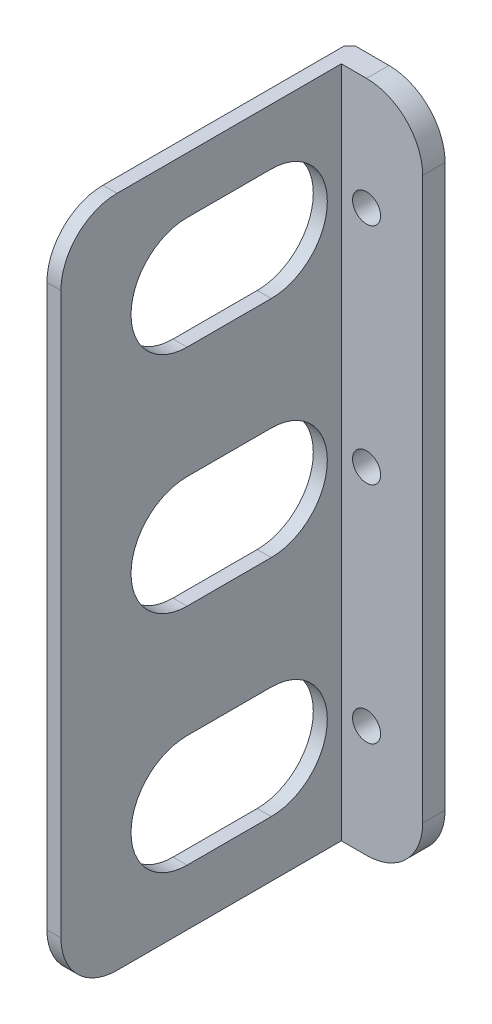
ISO-10303-21;
HEADER;
FILE_DESCRIPTION(('STEP AP214'),'2;1');
FILE_NAME('part.step','',(''),(''),'','','');
FILE_SCHEMA(('AUTOMOTIVE_DESIGN { 1 0 10303 214 1 1 1 1 }'));
ENDSEC;
DATA;
#1=APPLICATION_CONTEXT('core data for automotive mechanical design processes');
#2=APPLICATION_PROTOCOL_DEFINITION('international standard','automotive_design',2000,#1);
#3=PRODUCT_CONTEXT('',#1,'mechanical');
#4=PRODUCT('Part','Part','',(#3));
#5=PRODUCT_RELATED_PRODUCT_CATEGORY('part','',(#4));
#6=PRODUCT_DEFINITION_FORMATION('','',#4);
#7=PRODUCT_DEFINITION_CONTEXT('part definition',#1,'design');
#8=PRODUCT_DEFINITION('design','',#6,#7);
#9=PRODUCT_DEFINITION_SHAPE('','',#8);
#10=(LENGTH_UNIT() NAMED_UNIT(*) SI_UNIT(.MILLI.,.METRE.));
#11=(NAMED_UNIT(*) PLANE_ANGLE_UNIT() SI_UNIT($,.RADIAN.));
#12=(NAMED_UNIT(*) SI_UNIT($,.STERADIAN.) SOLID_ANGLE_UNIT());
#13=UNCERTAINTY_MEASURE_WITH_UNIT(LENGTH_MEASURE(1.E-05),#10,'distance_accuracy_value','');
#14=(GEOMETRIC_REPRESENTATION_CONTEXT(3) GLOBAL_UNCERTAINTY_ASSIGNED_CONTEXT((#13)) GLOBAL_UNIT_ASSIGNED_CONTEXT((#10,
#11,#12)) REPRESENTATION_CONTEXT('',''));
#15=CARTESIAN_POINT('',(0.,0.,0.));
#16=DIRECTION('',(0.,0.,1.));
#17=DIRECTION('',(1.,0.,0.));
#18=AXIS2_PLACEMENT_3D('',#15,#16,#17);
#19=CARTESIAN_POINT('',(0.,0.,0.));
#20=DIRECTION('',(0.,0.,1.));
#21=DIRECTION('',(1.,0.,0.));
#22=AXIS2_PLACEMENT_3D('',#19,#20,#21);
#23=PLANE('',#22);
#24=CARTESIAN_POINT('',(0.,-40.,0.));
#25=DIRECTION('',(0.,0.,1.));
#26=DIRECTION('',(1.,0.,0.));
#27=AXIS2_PLACEMENT_3D('',#24,#25,#26);
#28=CIRCLE('',#27,2.5);
#29=CARTESIAN_POINT('',(2.50000000000001,-40.,0.));
#30=VERTEX_POINT('',#29);
#31=EDGE_CURVE('E308',#30,#30,#28,.T.);
#32=ORIENTED_EDGE('',*,*,#31,.F.);
#33=EDGE_LOOP('',(#32));
#34=FACE_BOUND('',#33,.T.);
#35=CARTESIAN_POINT('',(0.,39.9999999999999,0.));
#36=DIRECTION('',(0.,0.,1.));
#37=DIRECTION('',(1.,0.,0.));
#38=AXIS2_PLACEMENT_3D('',#35,#36,#37);
#39=CIRCLE('',#38,2.5);
#40=CARTESIAN_POINT('',(2.5,39.9999999999999,0.));
#41=VERTEX_POINT('',#40);
#42=EDGE_CURVE('E329',#41,#41,#39,.T.);
#43=ORIENTED_EDGE('',*,*,#42,.F.);
#44=EDGE_LOOP('',(#43));
#45=FACE_BOUND('',#44,.T.);
#46=CARTESIAN_POINT('',(0.,0.,0.));
#47=DIRECTION('',(0.,0.,1.));
#48=DIRECTION('',(1.,0.,0.));
#49=AXIS2_PLACEMENT_3D('',#46,#47,#48);
#50=CIRCLE('',#49,2.5);
#51=CARTESIAN_POINT('',(2.5,0.,0.));
#52=VERTEX_POINT('',#51);
#53=EDGE_CURVE('E332',#52,#52,#50,.T.);
#54=ORIENTED_EDGE('',*,*,#53,.F.);
#55=EDGE_LOOP('',(#54));
#56=FACE_BOUND('',#55,.T.);
#57=DIRECTION('',(1.,0.,0.));
#58=VECTOR('',#57,1.);
#59=CARTESIAN_POINT('',(0.,-60.0000000000001,0.));
#60=LINE('',#59,#58);
#61=CARTESIAN_POINT('',(-4.49999999999996,-60.0000000000001,0.));
#62=VERTEX_POINT('',#61);
#63=CARTESIAN_POINT('',(0.,-60.0000000000001,0.));
#64=VERTEX_POINT('',#63);
#65=EDGE_CURVE('E338',#62,#64,#60,.T.);
#66=ORIENTED_EDGE('',*,*,#65,.T.);
#67=CARTESIAN_POINT('',(0.,-50.0000000000001,0.));
#68=DIRECTION('',(0.,0.,1.));
#69=DIRECTION('',(1.,0.,0.));
#70=AXIS2_PLACEMENT_3D('',#67,#68,#69);
#71=CIRCLE('',#70,10.);
#72=CARTESIAN_POINT('',(9.99999999999997,-50.0000000000001,0.));
#73=VERTEX_POINT('',#72);
#74=EDGE_CURVE('E354',#64,#73,#71,.T.);
#75=ORIENTED_EDGE('',*,*,#74,.T.);
#76=DIRECTION('',(0.,-1.,0.));
#77=VECTOR('',#76,1.);
#78=CARTESIAN_POINT('',(9.99999999999999,0.,0.));
#79=LINE('',#78,#77);
#80=CARTESIAN_POINT('',(10.,49.9999999999999,0.));
#81=VERTEX_POINT('',#80);
#82=EDGE_CURVE('E313',#81,#73,#79,.T.);
#83=ORIENTED_EDGE('',*,*,#82,.F.);
#84=CARTESIAN_POINT('',(0.,50.,0.));
#85=DIRECTION('',(0.,0.,1.));
#86=DIRECTION('',(1.,0.,0.));
#87=AXIS2_PLACEMENT_3D('',#84,#85,#86);
#88=CIRCLE('',#87,10.);
#89=CARTESIAN_POINT('',(0.,60.,0.));
#90=VERTEX_POINT('',#89);
#91=EDGE_CURVE('E352',#81,#90,#88,.T.);
#92=ORIENTED_EDGE('',*,*,#91,.T.);
#93=DIRECTION('',(1.,0.,0.));
#94=VECTOR('',#93,1.);
#95=CARTESIAN_POINT('',(0.,60.,0.));
#96=LINE('',#95,#94);
#97=CARTESIAN_POINT('',(-4.49999999999997,60.,0.));
#98=VERTEX_POINT('',#97);
#99=EDGE_CURVE('E335',#98,#90,#96,.T.);
#100=ORIENTED_EDGE('',*,*,#99,.F.);
#101=DIRECTION('',(0.,-1.,0.));
#102=VECTOR('',#101,1.);
#103=CARTESIAN_POINT('',(-4.49999999999996,0.,0.));
#104=LINE('',#103,#102);
#105=EDGE_CURVE('E295',#98,#62,#104,.T.);
#106=ORIENTED_EDGE('',*,*,#105,.T.);
#107=EDGE_LOOP('',(#66,#75,#83,#92,#100,#106));
#108=FACE_BOUND('',#107,.T.);
#109=ADVANCED_FACE('F41',(#34,#45,#56,#108),#23,.T.);
#110=CARTESIAN_POINT('',(0.,60.,-4.));
#111=DIRECTION('',(0.,-1.,0.));
#112=DIRECTION('',(1.,0.,0.));
#113=AXIS2_PLACEMENT_3D('',#110,#111,#112);
#114=PLANE('',#113);
#115=DIRECTION('',(1.,0.,0.));
#116=VECTOR('',#115,1.);
#117=CARTESIAN_POINT('',(0.,60.,-4.));
#118=LINE('',#117,#116);
#119=CARTESIAN_POINT('',(-5.99999999999995,60.,-4.));
#120=VERTEX_POINT('',#119);
#121=CARTESIAN_POINT('',(0.,60.,-4.));
#122=VERTEX_POINT('',#121);
#123=EDGE_CURVE('E319',#120,#122,#118,.T.);
#124=ORIENTED_EDGE('',*,*,#123,.F.);
#125=DIRECTION('',(-0.707106781186548,0.,0.707106781186548));
#126=VECTOR('',#125,1.);
#127=CARTESIAN_POINT('',(-6.99999999999996,60.,-3.));
#128=LINE('',#127,#126);
#129=CARTESIAN_POINT('',(-6.99999999999997,60.,-2.99999999999999));
#130=VERTEX_POINT('',#129);
#131=EDGE_CURVE('E11',#120,#130,#128,.T.);
#132=ORIENTED_EDGE('',*,*,#131,.T.);
#133=DIRECTION('',(0.,0.,1.));
#134=VECTOR('',#133,1.);
#135=CARTESIAN_POINT('',(-6.99999999999997,60.,-4.));
#136=LINE('',#135,#134);
#137=CARTESIAN_POINT('',(-6.99999999999997,60.,40.));
#138=VERTEX_POINT('',#137);
#139=EDGE_CURVE('E326',#130,#138,#136,.T.);
#140=ORIENTED_EDGE('',*,*,#139,.T.);
#141=DIRECTION('',(1.,0.,0.));
#142=VECTOR('',#141,1.);
#143=CARTESIAN_POINT('',(-4.49999999999997,60.,40.));
#144=LINE('',#143,#142);
#145=CARTESIAN_POINT('',(-4.49999999999997,60.,40.));
#146=VERTEX_POINT('',#145);
#147=EDGE_CURVE('E366',#138,#146,#144,.T.);
#148=ORIENTED_EDGE('',*,*,#147,.T.);
#149=DIRECTION('',(0.,0.,-1.));
#150=VECTOR('',#149,1.);
#151=CARTESIAN_POINT('',(-4.49999999999997,60.,50.));
#152=LINE('',#151,#150);
#153=EDGE_CURVE('E306',#146,#98,#152,.T.);
#154=ORIENTED_EDGE('',*,*,#153,.T.);
#155=ORIENTED_EDGE('',*,*,#99,.T.);
#156=DIRECTION('',(0.,0.,1.));
#157=VECTOR('',#156,1.);
#158=CARTESIAN_POINT('',(0.,60.,-4.));
#159=LINE('',#158,#157);
#160=EDGE_CURVE('E369',#90,#122,#159,.F.);
#161=ORIENTED_EDGE('',*,*,#160,.T.);
#162=EDGE_LOOP('',(#124,#132,#140,#148,#154,#155,#161));
#163=FACE_BOUND('',#162,.T.);
#164=ADVANCED_FACE('F414',(#163),#114,.F.);
#165=CARTESIAN_POINT('',(9.99999999999999,0.,-4.));
#166=DIRECTION('',(-1.,0.,0.));
#167=DIRECTION('',(0.,-1.,0.));
#168=AXIS2_PLACEMENT_3D('',#165,#166,#167);
#169=PLANE('',#168);
#170=ORIENTED_EDGE('',*,*,#82,.T.);
#171=DIRECTION('',(0.,0.,1.));
#172=VECTOR('',#171,1.);
#173=CARTESIAN_POINT('',(9.99999999999997,-50.0000000000001,-4.));
#174=LINE('',#173,#172);
#175=CARTESIAN_POINT('',(9.99999999999997,-50.0000000000001,-4.));
#176=VERTEX_POINT('',#175);
#177=EDGE_CURVE('E359',#73,#176,#174,.F.);
#178=ORIENTED_EDGE('',*,*,#177,.T.);
#179=DIRECTION('',(0.,-1.,0.));
#180=VECTOR('',#179,1.);
#181=CARTESIAN_POINT('',(9.99999999999999,0.,-4.));
#182=LINE('',#181,#180);
#183=CARTESIAN_POINT('',(10.,49.9999999999999,-4.));
#184=VERTEX_POINT('',#183);
#185=EDGE_CURVE('E323',#184,#176,#182,.T.);
#186=ORIENTED_EDGE('',*,*,#185,.F.);
#187=DIRECTION('',(0.,0.,1.));
#188=VECTOR('',#187,1.);
#189=CARTESIAN_POINT('',(10.,49.9999999999999,-4.));
#190=LINE('',#189,#188);
#191=EDGE_CURVE('E356',#184,#81,#190,.T.);
#192=ORIENTED_EDGE('',*,*,#191,.T.);
#193=EDGE_LOOP('',(#170,#178,#186,#192));
#194=FACE_BOUND('',#193,.T.);
#195=ADVANCED_FACE('F429',(#194),#169,.F.);
#196=CARTESIAN_POINT('',(0.,-60.0000000000001,-4.));
#197=DIRECTION('',(0.,-1.,0.));
#198=DIRECTION('',(1.,0.,0.));
#199=AXIS2_PLACEMENT_3D('',#196,#197,#198);
#200=PLANE('',#199);
#201=DIRECTION('',(0.,0.,1.));
#202=VECTOR('',#201,1.);
#203=CARTESIAN_POINT('',(-6.99999999999996,-60.0000000000001,-4.));
#204=LINE('',#203,#202);
#205=CARTESIAN_POINT('',(-6.99999999999996,-60.0000000000001,-2.99999999999999));
#206=VERTEX_POINT('',#205);
#207=CARTESIAN_POINT('',(-6.99999999999996,-60.0000000000001,40.));
#208=VERTEX_POINT('',#207);
#209=EDGE_CURVE('E343',#206,#208,#204,.T.);
#210=ORIENTED_EDGE('',*,*,#209,.F.);
#211=DIRECTION('',(0.707106781186548,0.,-0.707106781186548));
#212=VECTOR('',#211,1.);
#213=CARTESIAN_POINT('',(-2.99999999999998,-60.0000000000001,-6.99999999999996));
#214=LINE('',#213,#212);
#215=CARTESIAN_POINT('',(-5.99999999999994,-60.0000000000001,-4.));
#216=VERTEX_POINT('',#215);
#217=EDGE_CURVE('E64',#206,#216,#214,.T.);
#218=ORIENTED_EDGE('',*,*,#217,.T.);
#219=DIRECTION('',(1.,0.,0.));
#220=VECTOR('',#219,1.);
#221=CARTESIAN_POINT('',(0.,-60.0000000000001,-4.));
#222=LINE('',#221,#220);
#223=CARTESIAN_POINT('',(0.,-60.0000000000001,-4.));
#224=VERTEX_POINT('',#223);
#225=EDGE_CURVE('E321',#216,#224,#222,.T.);
#226=ORIENTED_EDGE('',*,*,#225,.T.);
#227=DIRECTION('',(0.,0.,1.));
#228=VECTOR('',#227,1.);
#229=CARTESIAN_POINT('',(0.,-60.0000000000001,0.));
#230=LINE('',#229,#228);
#231=EDGE_CURVE('E349',#224,#64,#230,.T.);
#232=ORIENTED_EDGE('',*,*,#231,.T.);
#233=ORIENTED_EDGE('',*,*,#65,.F.);
#234=DIRECTION('',(0.,0.,-1.));
#235=VECTOR('',#234,1.);
#236=CARTESIAN_POINT('',(-4.49999999999996,-60.0000000000001,50.));
#237=LINE('',#236,#235);
#238=CARTESIAN_POINT('',(-4.49999999999996,-60.0000000000001,40.));
#239=VERTEX_POINT('',#238);
#240=EDGE_CURVE('E302',#239,#62,#237,.T.);
#241=ORIENTED_EDGE('',*,*,#240,.F.);
#242=DIRECTION('',(1.,0.,0.));
#243=VECTOR('',#242,1.);
#244=CARTESIAN_POINT('',(0.,-60.0000000000001,40.));
#245=LINE('',#244,#243);
#246=EDGE_CURVE('E345',#239,#208,#245,.F.);
#247=ORIENTED_EDGE('',*,*,#246,.T.);
#248=EDGE_LOOP('',(#210,#218,#226,#232,#233,#241,#247));
#249=FACE_BOUND('',#248,.T.);
#250=ADVANCED_FACE('F395',(#249),#200,.T.);
#251=CARTESIAN_POINT('',(0.,0.,-4.));
#252=DIRECTION('',(0.,0.,1.));
#253=DIRECTION('',(1.,0.,0.));
#254=AXIS2_PLACEMENT_3D('',#251,#252,#253);
#255=CYLINDRICAL_SURFACE('',#254,2.5);
#256=CARTESIAN_POINT('',(0.,0.,-4.));
#257=DIRECTION('',(0.,0.,1.));
#258=DIRECTION('',(1.,0.,0.));
#259=AXIS2_PLACEMENT_3D('',#256,#257,#258);
#260=CIRCLE('',#259,2.5);
#261=CARTESIAN_POINT('',(2.5,0.,-4.));
#262=VERTEX_POINT('',#261);
#263=EDGE_CURVE('E316',#262,#262,#260,.T.);
#264=ORIENTED_EDGE('',*,*,#263,.F.);
#265=EDGE_LOOP('',(#264));
#266=FACE_BOUND('',#265,.T.);
#267=ORIENTED_EDGE('',*,*,#53,.T.);
#268=EDGE_LOOP('',(#267));
#269=FACE_BOUND('',#268,.T.);
#270=ADVANCED_FACE('F455',(#266,#269),#255,.F.);
#271=CARTESIAN_POINT('',(0.,39.9999999999999,-4.));
#272=DIRECTION('',(0.,0.,1.));
#273=DIRECTION('',(1.,0.,0.));
#274=AXIS2_PLACEMENT_3D('',#271,#272,#273);
#275=CYLINDRICAL_SURFACE('',#274,2.5);
#276=CARTESIAN_POINT('',(0.,39.9999999999999,-4.));
#277=DIRECTION('',(0.,0.,1.));
#278=DIRECTION('',(1.,0.,0.));
#279=AXIS2_PLACEMENT_3D('',#276,#277,#278);
#280=CIRCLE('',#279,2.5);
#281=CARTESIAN_POINT('',(2.5,39.9999999999999,-4.));
#282=VERTEX_POINT('',#281);
#283=EDGE_CURVE('E312',#282,#282,#280,.T.);
#284=ORIENTED_EDGE('',*,*,#283,.F.);
#285=EDGE_LOOP('',(#284));
#286=FACE_BOUND('',#285,.T.);
#287=ORIENTED_EDGE('',*,*,#42,.T.);
#288=EDGE_LOOP('',(#287));
#289=FACE_BOUND('',#288,.T.);
#290=ADVANCED_FACE('F462',(#286,#289),#275,.F.);
#291=CARTESIAN_POINT('',(0.,-40.,-4.));
#292=DIRECTION('',(0.,0.,1.));
#293=DIRECTION('',(1.,0.,0.));
#294=AXIS2_PLACEMENT_3D('',#291,#292,#293);
#295=CYLINDRICAL_SURFACE('',#294,2.5);
#296=CARTESIAN_POINT('',(0.,-40.,-4.));
#297=DIRECTION('',(0.,0.,1.));
#298=DIRECTION('',(1.,0.,0.));
#299=AXIS2_PLACEMENT_3D('',#296,#297,#298);
#300=CIRCLE('',#299,2.5);
#301=CARTESIAN_POINT('',(2.50000000000001,-40.,-4.));
#302=VERTEX_POINT('',#301);
#303=EDGE_CURVE('E309',#302,#302,#300,.T.);
#304=ORIENTED_EDGE('',*,*,#303,.F.);
#305=EDGE_LOOP('',(#304));
#306=FACE_BOUND('',#305,.T.);
#307=ORIENTED_EDGE('',*,*,#31,.T.);
#308=EDGE_LOOP('',(#307));
#309=FACE_BOUND('',#308,.T.);
#310=ADVANCED_FACE('F457',(#306,#309),#295,.F.);
#311=CARTESIAN_POINT('',(-6.99999999999996,0.,-4.));
#312=DIRECTION('',(-1.,0.,0.));
#313=DIRECTION('',(0.,-1.,0.));
#314=AXIS2_PLACEMENT_3D('',#311,#312,#313);
#315=PLANE('',#314);
#316=CARTESIAN_POINT('',(-6.99999999999996,-40.,12.5));
#317=DIRECTION('',(-1.,0.,0.));
#318=DIRECTION('',(0.,-1.,0.));
#319=AXIS2_PLACEMENT_3D('',#316,#317,#318);
#320=CIRCLE('',#319,10.);
#321=CARTESIAN_POINT('',(-6.99999999999996,-30.,12.5));
#322=VERTEX_POINT('',#321);
#323=CARTESIAN_POINT('',(-6.99999999999996,-50.,12.5));
#324=VERTEX_POINT('',#323);
#325=EDGE_CURVE('E293',#322,#324,#320,.T.);
#326=ORIENTED_EDGE('',*,*,#325,.F.);
#327=DIRECTION('',(0.,0.,-1.));
#328=VECTOR('',#327,1.);
#329=CARTESIAN_POINT('',(-6.99999999999996,-30.,-4.));
#330=LINE('',#329,#328);
#331=CARTESIAN_POINT('',(-6.99999999999996,-30.,27.5));
#332=VERTEX_POINT('',#331);
#333=EDGE_CURVE('E288',#332,#322,#330,.T.);
#334=ORIENTED_EDGE('',*,*,#333,.F.);
#335=CARTESIAN_POINT('',(-6.99999999999996,-40.,27.5));
#336=DIRECTION('',(-1.,0.,0.));
#337=DIRECTION('',(0.,-1.,0.));
#338=AXIS2_PLACEMENT_3D('',#335,#336,#337);
#339=CIRCLE('',#338,10.);
#340=CARTESIAN_POINT('',(-6.99999999999996,-50.,27.5));
#341=VERTEX_POINT('',#340);
#342=EDGE_CURVE('E203',#341,#332,#339,.T.);
#343=ORIENTED_EDGE('',*,*,#342,.F.);
#344=DIRECTION('',(0.,0.,1.));
#345=VECTOR('',#344,1.);
#346=CARTESIAN_POINT('',(-6.99999999999996,-50.,-4.));
#347=LINE('',#346,#345);
#348=EDGE_CURVE('E291',#324,#341,#347,.T.);
#349=ORIENTED_EDGE('',*,*,#348,.F.);
#350=EDGE_LOOP('',(#326,#334,#343,#349));
#351=FACE_BOUND('',#350,.T.);
#352=CARTESIAN_POINT('',(-6.99999999999996,0.,12.5));
#353=DIRECTION('',(-1.,0.,0.));
#354=DIRECTION('',(0.,-1.,0.));
#355=AXIS2_PLACEMENT_3D('',#352,#353,#354);
#356=CIRCLE('',#355,10.);
#357=CARTESIAN_POINT('',(-6.99999999999996,9.99999999999999,12.5));
#358=VERTEX_POINT('',#357);
#359=CARTESIAN_POINT('',(-6.99999999999996,-10.,12.5));
#360=VERTEX_POINT('',#359);
#361=EDGE_CURVE('E286',#358,#360,#356,.T.);
#362=ORIENTED_EDGE('',*,*,#361,.F.);
#363=DIRECTION('',(0.,0.,-1.));
#364=VECTOR('',#363,1.);
#365=CARTESIAN_POINT('',(-6.99999999999996,9.99999999999999,-4.));
#366=LINE('',#365,#364);
#367=CARTESIAN_POINT('',(-6.99999999999996,9.99999999999999,27.5));
#368=VERTEX_POINT('',#367);
#369=EDGE_CURVE('E279',#368,#358,#366,.T.);
#370=ORIENTED_EDGE('',*,*,#369,.F.);
#371=CARTESIAN_POINT('',(-6.99999999999996,0.,27.5));
#372=DIRECTION('',(-1.,0.,0.));
#373=DIRECTION('',(0.,-1.,0.));
#374=AXIS2_PLACEMENT_3D('',#371,#372,#373);
#375=CIRCLE('',#374,10.);
#376=CARTESIAN_POINT('',(-6.99999999999996,-10.,27.5));
#377=VERTEX_POINT('',#376);
#378=EDGE_CURVE('E281',#377,#368,#375,.T.);
#379=ORIENTED_EDGE('',*,*,#378,.F.);
#380=DIRECTION('',(0.,0.,1.));
#381=VECTOR('',#380,1.);
#382=CARTESIAN_POINT('',(-6.99999999999996,-10.,-4.));
#383=LINE('',#382,#381);
#384=EDGE_CURVE('E284',#360,#377,#383,.T.);
#385=ORIENTED_EDGE('',*,*,#384,.F.);
#386=EDGE_LOOP('',(#362,#370,#379,#385));
#387=FACE_BOUND('',#386,.T.);
#388=CARTESIAN_POINT('',(-6.99999999999997,40.,12.5));
#389=DIRECTION('',(-1.,0.,0.));
#390=DIRECTION('',(0.,-1.,0.));
#391=AXIS2_PLACEMENT_3D('',#388,#389,#390);
#392=CIRCLE('',#391,10.);
#393=CARTESIAN_POINT('',(-6.99999999999997,50.,12.5));
#394=VERTEX_POINT('',#393);
#395=CARTESIAN_POINT('',(-6.99999999999996,30.,12.5));
#396=VERTEX_POINT('',#395);
#397=EDGE_CURVE('E277',#394,#396,#392,.T.);
#398=ORIENTED_EDGE('',*,*,#397,.F.);
#399=DIRECTION('',(0.,0.,-1.));
#400=VECTOR('',#399,1.);
#401=CARTESIAN_POINT('',(-6.99999999999997,50.,-4.));
#402=LINE('',#401,#400);
#403=CARTESIAN_POINT('',(-6.99999999999997,50.,27.5));
#404=VERTEX_POINT('',#403);
#405=EDGE_CURVE('E228',#404,#394,#402,.T.);
#406=ORIENTED_EDGE('',*,*,#405,.F.);
#407=CARTESIAN_POINT('',(-6.99999999999997,40.,27.5));
#408=DIRECTION('',(-1.,0.,0.));
#409=DIRECTION('',(0.,-1.,0.));
#410=AXIS2_PLACEMENT_3D('',#407,#408,#409);
#411=CIRCLE('',#410,10.);
#412=CARTESIAN_POINT('',(-6.99999999999997,30.,27.5));
#413=VERTEX_POINT('',#412);
#414=EDGE_CURVE('E272',#413,#404,#411,.T.);
#415=ORIENTED_EDGE('',*,*,#414,.F.);
#416=DIRECTION('',(0.,0.,1.));
#417=VECTOR('',#416,1.);
#418=CARTESIAN_POINT('',(-6.99999999999997,30.,-4.));
#419=LINE('',#418,#417);
#420=EDGE_CURVE('E275',#396,#413,#419,.T.);
#421=ORIENTED_EDGE('',*,*,#420,.F.);
#422=EDGE_LOOP('',(#398,#406,#415,#421));
#423=FACE_BOUND('',#422,.T.);
#424=ORIENTED_EDGE('',*,*,#139,.F.);
#425=DIRECTION('',(0.,-1.,0.));
#426=VECTOR('',#425,1.);
#427=CARTESIAN_POINT('',(-6.99999999999996,-60.0000000000001,-2.99999999999999));
#428=LINE('',#427,#426);
#429=EDGE_CURVE('E386',#130,#206,#428,.T.);
#430=ORIENTED_EDGE('',*,*,#429,.T.);
#431=ORIENTED_EDGE('',*,*,#209,.T.);
#432=CARTESIAN_POINT('',(-6.99999999999996,-50.0000000000001,40.));
#433=DIRECTION('',(-1.,0.,0.));
#434=DIRECTION('',(0.,-1.,0.));
#435=AXIS2_PLACEMENT_3D('',#432,#433,#434);
#436=CIRCLE('',#435,10.);
#437=CARTESIAN_POINT('',(-6.99999999999996,-50.0000000000001,50.));
#438=VERTEX_POINT('',#437);
#439=EDGE_CURVE('E381',#208,#438,#436,.T.);
#440=ORIENTED_EDGE('',*,*,#439,.T.);
#441=DIRECTION('',(0.,-1.,0.));
#442=VECTOR('',#441,1.);
#443=CARTESIAN_POINT('',(-6.99999999999996,0.,50.));
#444=LINE('',#443,#442);
#445=CARTESIAN_POINT('',(-6.99999999999997,50.,50.));
#446=VERTEX_POINT('',#445);
#447=EDGE_CURVE('E299',#446,#438,#444,.T.);
#448=ORIENTED_EDGE('',*,*,#447,.F.);
#449=CARTESIAN_POINT('',(-6.99999999999997,50.,40.));
#450=DIRECTION('',(-1.,0.,0.));
#451=DIRECTION('',(0.,-1.,0.));
#452=AXIS2_PLACEMENT_3D('',#449,#450,#451);
#453=CIRCLE('',#452,10.);
#454=EDGE_CURVE('E383',#446,#138,#453,.T.);
#455=ORIENTED_EDGE('',*,*,#454,.T.);
#456=EDGE_LOOP('',(#424,#430,#431,#440,#448,#455));
#457=FACE_BOUND('',#456,.T.);
#458=ADVANCED_FACE('F392',(#351,#387,#423,#457),#315,.T.);
#459=CARTESIAN_POINT('',(0.,0.,-4.));
#460=DIRECTION('',(0.,0.,1.));
#461=DIRECTION('',(1.,0.,0.));
#462=AXIS2_PLACEMENT_3D('',#459,#460,#461);
#463=PLANE('',#462);
#464=ORIENTED_EDGE('',*,*,#303,.T.);
#465=EDGE_LOOP('',(#464));
#466=FACE_BOUND('',#465,.T.);
#467=ORIENTED_EDGE('',*,*,#283,.T.);
#468=EDGE_LOOP('',(#467));
#469=FACE_BOUND('',#468,.T.);
#470=ORIENTED_EDGE('',*,*,#263,.T.);
#471=EDGE_LOOP('',(#470));
#472=FACE_BOUND('',#471,.T.);
#473=ORIENTED_EDGE('',*,*,#225,.F.);
#474=DIRECTION('',(0.,1.,0.));
#475=VECTOR('',#474,1.);
#476=CARTESIAN_POINT('',(-5.99999999999995,60.,-4.));
#477=LINE('',#476,#475);
#478=EDGE_CURVE('E50',#216,#120,#477,.T.);
#479=ORIENTED_EDGE('',*,*,#478,.T.);
#480=ORIENTED_EDGE('',*,*,#123,.T.);
#481=CARTESIAN_POINT('',(0.,50.,-4.));
#482=DIRECTION('',(0.,0.,1.));
#483=DIRECTION('',(1.,0.,0.));
#484=AXIS2_PLACEMENT_3D('',#481,#482,#483);
#485=CIRCLE('',#484,10.);
#486=EDGE_CURVE('E361',#122,#184,#485,.F.);
#487=ORIENTED_EDGE('',*,*,#486,.T.);
#488=ORIENTED_EDGE('',*,*,#185,.T.);
#489=CARTESIAN_POINT('',(0.,-50.0000000000001,-4.));
#490=DIRECTION('',(0.,0.,1.));
#491=DIRECTION('',(1.,0.,0.));
#492=AXIS2_PLACEMENT_3D('',#489,#490,#491);
#493=CIRCLE('',#492,10.);
#494=EDGE_CURVE('E363',#176,#224,#493,.F.);
#495=ORIENTED_EDGE('',*,*,#494,.T.);
#496=EDGE_LOOP('',(#473,#479,#480,#487,#488,#495));
#497=FACE_BOUND('',#496,.T.);
#498=ADVANCED_FACE('F426',(#466,#469,#472,#497),#463,.F.);
#499=CARTESIAN_POINT('',(-4.49999999999996,0.,50.));
#500=DIRECTION('',(1.,0.,0.));
#501=DIRECTION('',(0.,1.,0.));
#502=AXIS2_PLACEMENT_3D('',#499,#500,#501);
#503=PLANE('',#502);
#504=CARTESIAN_POINT('',(-4.49999999999996,-40.,12.5));
#505=DIRECTION('',(1.,0.,0.));
#506=DIRECTION('',(0.,1.,0.));
#507=AXIS2_PLACEMENT_3D('',#504,#505,#506);
#508=CIRCLE('',#507,10.);
#509=CARTESIAN_POINT('',(-4.49999999999996,-50.,12.5));
#510=VERTEX_POINT('',#509);
#511=CARTESIAN_POINT('',(-4.49999999999996,-30.,12.5));
#512=VERTEX_POINT('',#511);
#513=EDGE_CURVE('E216',#510,#512,#508,.T.);
#514=ORIENTED_EDGE('',*,*,#513,.F.);
#515=DIRECTION('',(0.,0.,-1.));
#516=VECTOR('',#515,1.);
#517=CARTESIAN_POINT('',(-4.49999999999996,-50.,12.5));
#518=LINE('',#517,#516);
#519=CARTESIAN_POINT('',(-4.49999999999996,-50.,27.5));
#520=VERTEX_POINT('',#519);
#521=EDGE_CURVE('E221',#520,#510,#518,.T.);
#522=ORIENTED_EDGE('',*,*,#521,.F.);
#523=CARTESIAN_POINT('',(-4.49999999999996,-40.,27.5));
#524=DIRECTION('',(1.,0.,0.));
#525=DIRECTION('',(0.,1.,0.));
#526=AXIS2_PLACEMENT_3D('',#523,#524,#525);
#527=CIRCLE('',#526,10.);
#528=CARTESIAN_POINT('',(-4.49999999999996,-30.,27.5));
#529=VERTEX_POINT('',#528);
#530=EDGE_CURVE('E200',#529,#520,#527,.T.);
#531=ORIENTED_EDGE('',*,*,#530,.F.);
#532=DIRECTION('',(0.,0.,1.));
#533=VECTOR('',#532,1.);
#534=CARTESIAN_POINT('',(-4.49999999999996,-30.,12.5));
#535=LINE('',#534,#533);
#536=EDGE_CURVE('E211',#512,#529,#535,.T.);
#537=ORIENTED_EDGE('',*,*,#536,.F.);
#538=EDGE_LOOP('',(#514,#522,#531,#537));
#539=FACE_BOUND('',#538,.T.);
#540=CARTESIAN_POINT('',(-4.49999999999996,0.,12.5));
#541=DIRECTION('',(1.,0.,0.));
#542=DIRECTION('',(0.,1.,0.));
#543=AXIS2_PLACEMENT_3D('',#540,#541,#542);
#544=CIRCLE('',#543,10.);
#545=CARTESIAN_POINT('',(-4.49999999999996,-10.,12.5));
#546=VERTEX_POINT('',#545);
#547=CARTESIAN_POINT('',(-4.49999999999997,10.,12.5));
#548=VERTEX_POINT('',#547);
#549=EDGE_CURVE('E250',#546,#548,#544,.T.);
#550=ORIENTED_EDGE('',*,*,#549,.F.);
#551=DIRECTION('',(0.,0.,-1.));
#552=VECTOR('',#551,1.);
#553=CARTESIAN_POINT('',(-4.49999999999996,-10.,12.5));
#554=LINE('',#553,#552);
#555=CARTESIAN_POINT('',(-4.49999999999996,-10.,27.5));
#556=VERTEX_POINT('',#555);
#557=EDGE_CURVE('E234',#556,#546,#554,.T.);
#558=ORIENTED_EDGE('',*,*,#557,.F.);
#559=CARTESIAN_POINT('',(-4.49999999999996,0.,27.5));
#560=DIRECTION('',(1.,0.,0.));
#561=DIRECTION('',(0.,1.,0.));
#562=AXIS2_PLACEMENT_3D('',#559,#560,#561);
#563=CIRCLE('',#562,10.);
#564=CARTESIAN_POINT('',(-4.49999999999997,10.,27.5));
#565=VERTEX_POINT('',#564);
#566=EDGE_CURVE('E244',#565,#556,#563,.T.);
#567=ORIENTED_EDGE('',*,*,#566,.F.);
#568=DIRECTION('',(0.,0.,1.));
#569=VECTOR('',#568,1.);
#570=CARTESIAN_POINT('',(-4.49999999999997,10.,12.5));
#571=LINE('',#570,#569);
#572=EDGE_CURVE('E247',#548,#565,#571,.T.);
#573=ORIENTED_EDGE('',*,*,#572,.F.);
#574=EDGE_LOOP('',(#550,#558,#567,#573));
#575=FACE_BOUND('',#574,.T.);
#576=CARTESIAN_POINT('',(-4.49999999999997,40.,12.5));
#577=DIRECTION('',(1.,0.,0.));
#578=DIRECTION('',(0.,1.,0.));
#579=AXIS2_PLACEMENT_3D('',#576,#577,#578);
#580=CIRCLE('',#579,10.);
#581=CARTESIAN_POINT('',(-4.49999999999997,30.,12.5));
#582=VERTEX_POINT('',#581);
#583=CARTESIAN_POINT('',(-4.49999999999997,50.,12.5));
#584=VERTEX_POINT('',#583);
#585=EDGE_CURVE('E241',#582,#584,#580,.T.);
#586=ORIENTED_EDGE('',*,*,#585,.F.);
#587=DIRECTION('',(0.,0.,-1.));
#588=VECTOR('',#587,1.);
#589=CARTESIAN_POINT('',(-4.49999999999997,30.,12.5));
#590=LINE('',#589,#588);
#591=CARTESIAN_POINT('',(-4.49999999999997,30.,27.5));
#592=VERTEX_POINT('',#591);
#593=EDGE_CURVE('E255',#592,#582,#590,.T.);
#594=ORIENTED_EDGE('',*,*,#593,.F.);
#595=CARTESIAN_POINT('',(-4.49999999999997,40.,27.5));
#596=DIRECTION('',(1.,0.,0.));
#597=DIRECTION('',(0.,1.,0.));
#598=AXIS2_PLACEMENT_3D('',#595,#596,#597);
#599=CIRCLE('',#598,10.);
#600=CARTESIAN_POINT('',(-4.49999999999997,50.,27.5));
#601=VERTEX_POINT('',#600);
#602=EDGE_CURVE('E264',#601,#592,#599,.T.);
#603=ORIENTED_EDGE('',*,*,#602,.F.);
#604=DIRECTION('',(0.,0.,1.));
#605=VECTOR('',#604,1.);
#606=CARTESIAN_POINT('',(-4.49999999999997,50.,12.5));
#607=LINE('',#606,#605);
#608=EDGE_CURVE('E267',#584,#601,#607,.T.);
#609=ORIENTED_EDGE('',*,*,#608,.F.);
#610=EDGE_LOOP('',(#586,#594,#603,#609));
#611=FACE_BOUND('',#610,.T.);
#612=ORIENTED_EDGE('',*,*,#153,.F.);
#613=CARTESIAN_POINT('',(-4.49999999999997,50.,40.));
#614=DIRECTION('',(1.,0.,0.));
#615=DIRECTION('',(0.,1.,0.));
#616=AXIS2_PLACEMENT_3D('',#613,#614,#615);
#617=CIRCLE('',#616,10.);
#618=CARTESIAN_POINT('',(-4.49999999999997,50.,50.));
#619=VERTEX_POINT('',#618);
#620=EDGE_CURVE('E374',#146,#619,#617,.T.);
#621=ORIENTED_EDGE('',*,*,#620,.T.);
#622=DIRECTION('',(0.,-1.,0.));
#623=VECTOR('',#622,1.);
#624=CARTESIAN_POINT('',(-4.49999999999996,0.,50.));
#625=LINE('',#624,#623);
#626=CARTESIAN_POINT('',(-4.49999999999996,-50.0000000000001,50.));
#627=VERTEX_POINT('',#626);
#628=EDGE_CURVE('E296',#619,#627,#625,.T.);
#629=ORIENTED_EDGE('',*,*,#628,.T.);
#630=CARTESIAN_POINT('',(-4.49999999999996,-50.0000000000001,40.));
#631=DIRECTION('',(1.,0.,0.));
#632=DIRECTION('',(0.,1.,0.));
#633=AXIS2_PLACEMENT_3D('',#630,#631,#632);
#634=CIRCLE('',#633,10.);
#635=EDGE_CURVE('E372',#627,#239,#634,.T.);
#636=ORIENTED_EDGE('',*,*,#635,.T.);
#637=ORIENTED_EDGE('',*,*,#240,.T.);
#638=ORIENTED_EDGE('',*,*,#105,.F.);
#639=EDGE_LOOP('',(#612,#621,#629,#636,#637,#638));
#640=FACE_BOUND('',#639,.T.);
#641=ADVANCED_FACE('F218',(#539,#575,#611,#640),#503,.T.);
#642=CARTESIAN_POINT('',(0.,0.,50.));
#643=DIRECTION('',(0.,0.,1.));
#644=DIRECTION('',(1.,0.,0.));
#645=AXIS2_PLACEMENT_3D('',#642,#643,#644);
#646=PLANE('',#645);
#647=ORIENTED_EDGE('',*,*,#628,.F.);
#648=DIRECTION('',(1.,0.,0.));
#649=VECTOR('',#648,1.);
#650=CARTESIAN_POINT('',(-6.99999999999997,50.,50.));
#651=LINE('',#650,#649);
#652=EDGE_CURVE('E379',#619,#446,#651,.F.);
#653=ORIENTED_EDGE('',*,*,#652,.T.);
#654=ORIENTED_EDGE('',*,*,#447,.T.);
#655=DIRECTION('',(1.,0.,0.));
#656=VECTOR('',#655,1.);
#657=CARTESIAN_POINT('',(0.,-50.0000000000001,50.));
#658=LINE('',#657,#656);
#659=EDGE_CURVE('E376',#438,#627,#658,.T.);
#660=ORIENTED_EDGE('',*,*,#659,.T.);
#661=EDGE_LOOP('',(#647,#653,#654,#660));
#662=FACE_BOUND('',#661,.T.);
#663=ADVANCED_FACE('F407',(#662),#646,.T.);
#664=CARTESIAN_POINT('',(0.,-50.0000000000001,-4.));
#665=DIRECTION('',(0.,0.,-1.));
#666=DIRECTION('',(-1.,0.,0.));
#667=AXIS2_PLACEMENT_3D('',#664,#665,#666);
#668=CYLINDRICAL_SURFACE('',#667,10.);
#669=ORIENTED_EDGE('',*,*,#494,.F.);
#670=ORIENTED_EDGE('',*,*,#177,.F.);
#671=ORIENTED_EDGE('',*,*,#74,.F.);
#672=ORIENTED_EDGE('',*,*,#231,.F.);
#673=EDGE_LOOP('',(#669,#670,#671,#672));
#674=FACE_BOUND('',#673,.T.);
#675=ADVANCED_FACE('F432',(#674),#668,.T.);
#676=CARTESIAN_POINT('',(0.,50.,-4.));
#677=DIRECTION('',(0.,0.,1.));
#678=DIRECTION('',(1.,0.,0.));
#679=AXIS2_PLACEMENT_3D('',#676,#677,#678);
#680=CYLINDRICAL_SURFACE('',#679,10.);
#681=ORIENTED_EDGE('',*,*,#486,.F.);
#682=ORIENTED_EDGE('',*,*,#160,.F.);
#683=ORIENTED_EDGE('',*,*,#91,.F.);
#684=ORIENTED_EDGE('',*,*,#191,.F.);
#685=EDGE_LOOP('',(#681,#682,#683,#684));
#686=FACE_BOUND('',#685,.T.);
#687=ADVANCED_FACE('F423',(#686),#680,.T.);
#688=CARTESIAN_POINT('',(0.,50.,40.));
#689=DIRECTION('',(-1.,0.,0.));
#690=DIRECTION('',(0.,-1.,0.));
#691=AXIS2_PLACEMENT_3D('',#688,#689,#690);
#692=CYLINDRICAL_SURFACE('',#691,10.);
#693=ORIENTED_EDGE('',*,*,#454,.F.);
#694=ORIENTED_EDGE('',*,*,#652,.F.);
#695=ORIENTED_EDGE('',*,*,#620,.F.);
#696=ORIENTED_EDGE('',*,*,#147,.F.);
#697=EDGE_LOOP('',(#693,#694,#695,#696));
#698=FACE_BOUND('',#697,.T.);
#699=ADVANCED_FACE('F410',(#698),#692,.T.);
#700=CARTESIAN_POINT('',(0.,-50.0000000000001,40.));
#701=DIRECTION('',(1.,0.,0.));
#702=DIRECTION('',(0.,1.,0.));
#703=AXIS2_PLACEMENT_3D('',#700,#701,#702);
#704=CYLINDRICAL_SURFACE('',#703,10.);
#705=ORIENTED_EDGE('',*,*,#439,.F.);
#706=ORIENTED_EDGE('',*,*,#246,.F.);
#707=ORIENTED_EDGE('',*,*,#635,.F.);
#708=ORIENTED_EDGE('',*,*,#659,.F.);
#709=EDGE_LOOP('',(#705,#706,#707,#708));
#710=FACE_BOUND('',#709,.T.);
#711=ADVANCED_FACE('F402',(#710),#704,.T.);
#712=CARTESIAN_POINT('',(-54.5,40.,12.5));
#713=DIRECTION('',(1.,0.,0.));
#714=DIRECTION('',(0.,1.,0.));
#715=AXIS2_PLACEMENT_3D('',#712,#713,#714);
#716=CYLINDRICAL_SURFACE('',#715,10.);
#717=ORIENTED_EDGE('',*,*,#397,.T.);
#718=DIRECTION('',(1.,0.,0.));
#719=VECTOR('',#718,1.);
#720=CARTESIAN_POINT('',(-54.5,30.,12.5));
#721=LINE('',#720,#719);
#722=EDGE_CURVE('E260',#396,#582,#721,.T.);
#723=ORIENTED_EDGE('',*,*,#722,.T.);
#724=ORIENTED_EDGE('',*,*,#585,.T.);
#725=DIRECTION('',(1.,0.,0.));
#726=VECTOR('',#725,1.);
#727=CARTESIAN_POINT('',(-54.5,50.,12.5));
#728=LINE('',#727,#726);
#729=EDGE_CURVE('E252',#394,#584,#728,.T.);
#730=ORIENTED_EDGE('',*,*,#729,.F.);
#731=EDGE_LOOP('',(#717,#723,#724,#730));
#732=FACE_BOUND('',#731,.T.);
#733=ADVANCED_FACE('F476',(#732),#716,.F.);
#734=CARTESIAN_POINT('',(-54.5,30.,12.5));
#735=DIRECTION('',(0.,-1.,0.));
#736=DIRECTION('',(1.,0.,0.));
#737=AXIS2_PLACEMENT_3D('',#734,#735,#736);
#738=PLANE('',#737);
#739=ORIENTED_EDGE('',*,*,#420,.T.);
#740=DIRECTION('',(1.,0.,0.));
#741=VECTOR('',#740,1.);
#742=CARTESIAN_POINT('',(-54.5,30.,27.5));
#743=LINE('',#742,#741);
#744=EDGE_CURVE('E258',#413,#592,#743,.T.);
#745=ORIENTED_EDGE('',*,*,#744,.T.);
#746=ORIENTED_EDGE('',*,*,#593,.T.);
#747=ORIENTED_EDGE('',*,*,#722,.F.);
#748=EDGE_LOOP('',(#739,#745,#746,#747));
#749=FACE_BOUND('',#748,.T.);
#750=ADVANCED_FACE('F480',(#749),#738,.F.);
#751=CARTESIAN_POINT('',(-54.5,40.,27.5));
#752=DIRECTION('',(1.,0.,0.));
#753=DIRECTION('',(0.,1.,0.));
#754=AXIS2_PLACEMENT_3D('',#751,#752,#753);
#755=CYLINDRICAL_SURFACE('',#754,10.);
#756=ORIENTED_EDGE('',*,*,#414,.T.);
#757=DIRECTION('',(1.,0.,0.));
#758=VECTOR('',#757,1.);
#759=CARTESIAN_POINT('',(-54.5,50.,27.5));
#760=LINE('',#759,#758);
#761=EDGE_CURVE('E256',#404,#601,#760,.T.);
#762=ORIENTED_EDGE('',*,*,#761,.T.);
#763=ORIENTED_EDGE('',*,*,#602,.T.);
#764=ORIENTED_EDGE('',*,*,#744,.F.);
#765=EDGE_LOOP('',(#756,#762,#763,#764));
#766=FACE_BOUND('',#765,.T.);
#767=ADVANCED_FACE('F486',(#766),#755,.F.);
#768=CARTESIAN_POINT('',(-54.5,50.,12.5));
#769=DIRECTION('',(0.,1.,0.));
#770=DIRECTION('',(-1.,0.,0.));
#771=AXIS2_PLACEMENT_3D('',#768,#769,#770);
#772=PLANE('',#771);
#773=ORIENTED_EDGE('',*,*,#405,.T.);
#774=ORIENTED_EDGE('',*,*,#729,.T.);
#775=ORIENTED_EDGE('',*,*,#608,.T.);
#776=ORIENTED_EDGE('',*,*,#761,.F.);
#777=EDGE_LOOP('',(#773,#774,#775,#776));
#778=FACE_BOUND('',#777,.T.);
#779=ADVANCED_FACE('F493',(#778),#772,.F.);
#780=CARTESIAN_POINT('',(-54.5,0.,12.5));
#781=DIRECTION('',(1.,0.,0.));
#782=DIRECTION('',(0.,1.,0.));
#783=AXIS2_PLACEMENT_3D('',#780,#781,#782);
#784=CYLINDRICAL_SURFACE('',#783,10.);
#785=ORIENTED_EDGE('',*,*,#361,.T.);
#786=DIRECTION('',(1.,0.,0.));
#787=VECTOR('',#786,1.);
#788=CARTESIAN_POINT('',(-54.5,-10.,12.5));
#789=LINE('',#788,#787);
#790=EDGE_CURVE('E239',#360,#546,#789,.T.);
#791=ORIENTED_EDGE('',*,*,#790,.T.);
#792=ORIENTED_EDGE('',*,*,#549,.T.);
#793=DIRECTION('',(1.,0.,0.));
#794=VECTOR('',#793,1.);
#795=CARTESIAN_POINT('',(-54.5,9.99999999999999,12.5));
#796=LINE('',#795,#794);
#797=EDGE_CURVE('E231',#358,#548,#796,.T.);
#798=ORIENTED_EDGE('',*,*,#797,.F.);
#799=EDGE_LOOP('',(#785,#791,#792,#798));
#800=FACE_BOUND('',#799,.T.);
#801=ADVANCED_FACE('F496',(#800),#784,.F.);
#802=CARTESIAN_POINT('',(-54.5,-10.,12.5));
#803=DIRECTION('',(0.,-1.,0.));
#804=DIRECTION('',(1.,0.,0.));
#805=AXIS2_PLACEMENT_3D('',#802,#803,#804);
#806=PLANE('',#805);
#807=ORIENTED_EDGE('',*,*,#384,.T.);
#808=DIRECTION('',(1.,0.,0.));
#809=VECTOR('',#808,1.);
#810=CARTESIAN_POINT('',(-54.5,-10.,27.5));
#811=LINE('',#810,#809);
#812=EDGE_CURVE('E237',#377,#556,#811,.T.);
#813=ORIENTED_EDGE('',*,*,#812,.T.);
#814=ORIENTED_EDGE('',*,*,#557,.T.);
#815=ORIENTED_EDGE('',*,*,#790,.F.);
#816=EDGE_LOOP('',(#807,#813,#814,#815));
#817=FACE_BOUND('',#816,.T.);
#818=ADVANCED_FACE('F491',(#817),#806,.F.);
#819=CARTESIAN_POINT('',(-54.5,0.,27.5));
#820=DIRECTION('',(1.,0.,0.));
#821=DIRECTION('',(0.,1.,0.));
#822=AXIS2_PLACEMENT_3D('',#819,#820,#821);
#823=CYLINDRICAL_SURFACE('',#822,10.);
#824=ORIENTED_EDGE('',*,*,#378,.T.);
#825=DIRECTION('',(1.,0.,0.));
#826=VECTOR('',#825,1.);
#827=CARTESIAN_POINT('',(-54.5,9.99999999999999,27.5));
#828=LINE('',#827,#826);
#829=EDGE_CURVE('E235',#368,#565,#828,.T.);
#830=ORIENTED_EDGE('',*,*,#829,.T.);
#831=ORIENTED_EDGE('',*,*,#566,.T.);
#832=ORIENTED_EDGE('',*,*,#812,.F.);
#833=EDGE_LOOP('',(#824,#830,#831,#832));
#834=FACE_BOUND('',#833,.T.);
#835=ADVANCED_FACE('F600',(#834),#823,.F.);
#836=CARTESIAN_POINT('',(-54.5,9.99999999999999,12.5));
#837=DIRECTION('',(0.,1.,0.));
#838=DIRECTION('',(-1.,0.,0.));
#839=AXIS2_PLACEMENT_3D('',#836,#837,#838);
#840=PLANE('',#839);
#841=ORIENTED_EDGE('',*,*,#369,.T.);
#842=ORIENTED_EDGE('',*,*,#797,.T.);
#843=ORIENTED_EDGE('',*,*,#572,.T.);
#844=ORIENTED_EDGE('',*,*,#829,.F.);
#845=EDGE_LOOP('',(#841,#842,#843,#844));
#846=FACE_BOUND('',#845,.T.);
#847=ADVANCED_FACE('F589',(#846),#840,.F.);
#848=CARTESIAN_POINT('',(-54.5,-40.,12.5));
#849=DIRECTION('',(1.,0.,0.));
#850=DIRECTION('',(0.,1.,0.));
#851=AXIS2_PLACEMENT_3D('',#848,#849,#850);
#852=CYLINDRICAL_SURFACE('',#851,10.);
#853=ORIENTED_EDGE('',*,*,#325,.T.);
#854=DIRECTION('',(1.,0.,0.));
#855=VECTOR('',#854,1.);
#856=CARTESIAN_POINT('',(-54.5,-50.,12.5));
#857=LINE('',#856,#855);
#858=EDGE_CURVE('E226',#324,#510,#857,.T.);
#859=ORIENTED_EDGE('',*,*,#858,.T.);
#860=ORIENTED_EDGE('',*,*,#513,.T.);
#861=DIRECTION('',(1.,0.,0.));
#862=VECTOR('',#861,1.);
#863=CARTESIAN_POINT('',(-54.5,-30.,12.5));
#864=LINE('',#863,#862);
#865=EDGE_CURVE('E207',#322,#512,#864,.T.);
#866=ORIENTED_EDGE('',*,*,#865,.F.);
#867=EDGE_LOOP('',(#853,#859,#860,#866));
#868=FACE_BOUND('',#867,.T.);
#869=ADVANCED_FACE('F578',(#868),#852,.F.);
#870=CARTESIAN_POINT('',(-54.5,-50.,12.5));
#871=DIRECTION('',(0.,-1.,0.));
#872=DIRECTION('',(1.,0.,0.));
#873=AXIS2_PLACEMENT_3D('',#870,#871,#872);
#874=PLANE('',#873);
#875=ORIENTED_EDGE('',*,*,#348,.T.);
#876=DIRECTION('',(1.,0.,0.));
#877=VECTOR('',#876,1.);
#878=CARTESIAN_POINT('',(-54.5,-50.,27.5));
#879=LINE('',#878,#877);
#880=EDGE_CURVE('E206',#341,#520,#879,.T.);
#881=ORIENTED_EDGE('',*,*,#880,.T.);
#882=ORIENTED_EDGE('',*,*,#521,.T.);
#883=ORIENTED_EDGE('',*,*,#858,.F.);
#884=EDGE_LOOP('',(#875,#881,#882,#883));
#885=FACE_BOUND('',#884,.T.);
#886=ADVANCED_FACE('F568',(#885),#874,.F.);
#887=CARTESIAN_POINT('',(-54.5,-40.,27.5));
#888=DIRECTION('',(1.,0.,0.));
#889=DIRECTION('',(0.,1.,0.));
#890=AXIS2_PLACEMENT_3D('',#887,#888,#889);
#891=CYLINDRICAL_SURFACE('',#890,10.);
#892=ORIENTED_EDGE('',*,*,#342,.T.);
#893=DIRECTION('',(1.,0.,0.));
#894=VECTOR('',#893,1.);
#895=CARTESIAN_POINT('',(-54.5,-30.,27.5));
#896=LINE('',#895,#894);
#897=EDGE_CURVE('E195',#332,#529,#896,.T.);
#898=ORIENTED_EDGE('',*,*,#897,.T.);
#899=ORIENTED_EDGE('',*,*,#530,.T.);
#900=ORIENTED_EDGE('',*,*,#880,.F.);
#901=EDGE_LOOP('',(#892,#898,#899,#900));
#902=FACE_BOUND('',#901,.T.);
#903=ADVANCED_FACE('F197',(#902),#891,.F.);
#904=CARTESIAN_POINT('',(-54.5,-30.,12.5));
#905=DIRECTION('',(0.,1.,0.));
#906=DIRECTION('',(-1.,0.,0.));
#907=AXIS2_PLACEMENT_3D('',#904,#905,#906);
#908=PLANE('',#907);
#909=ORIENTED_EDGE('',*,*,#333,.T.);
#910=ORIENTED_EDGE('',*,*,#865,.T.);
#911=ORIENTED_EDGE('',*,*,#536,.T.);
#912=ORIENTED_EDGE('',*,*,#897,.F.);
#913=EDGE_LOOP('',(#909,#910,#911,#912));
#914=FACE_BOUND('',#913,.T.);
#915=ADVANCED_FACE('F212',(#914),#908,.F.);
#916=CARTESIAN_POINT('',(-6.99999999999996,0.,-2.99999999999999));
#917=DIRECTION('',(-0.707106781186547,0.,-0.707106781186547));
#918=DIRECTION('',(0.,1.,0.));
#919=AXIS2_PLACEMENT_3D('',#916,#917,#918);
#920=PLANE('',#919);
#921=ORIENTED_EDGE('',*,*,#131,.F.);
#922=ORIENTED_EDGE('',*,*,#478,.F.);
#923=ORIENTED_EDGE('',*,*,#217,.F.);
#924=ORIENTED_EDGE('',*,*,#429,.F.);
#925=EDGE_LOOP('',(#921,#922,#923,#924));
#926=FACE_BOUND('',#925,.T.);
#927=ADVANCED_FACE('F44',(#926),#920,.T.);
#928=CLOSED_SHELL('',(#109,#164,#195,#250,#270,#290,#310,#458,#498,#641,#663,#675,#687,#699,
#711,#733,#750,#767,#779,#801,#818,#835,#847,#869,#886,#903,#915,#927));
#929=MANIFOLD_SOLID_BREP('B2',#928);
#930=ADVANCED_BREP_SHAPE_REPRESENTATION('',(#18,#929),#14);
#931=SHAPE_DEFINITION_REPRESENTATION(#9,#930);
ENDSEC;
END-ISO-10303-21;
